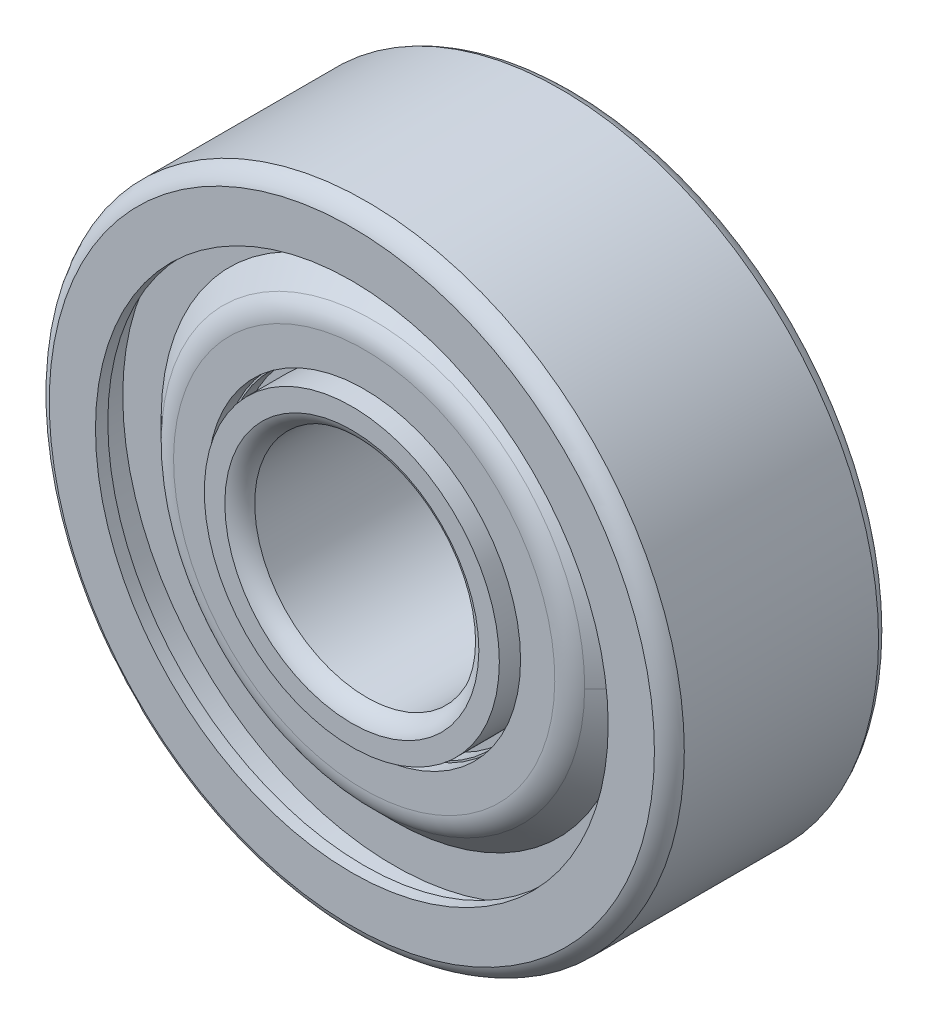
ISO-10303-21;
HEADER;
FILE_DESCRIPTION(('STEP AP214'),'2;1');
FILE_NAME('part.step','',(''),(''),'','','');
FILE_SCHEMA(('AUTOMOTIVE_DESIGN { 1 0 10303 214 1 1 1 1 }'));
ENDSEC;
DATA;
#1=APPLICATION_CONTEXT('core data for automotive mechanical design processes');
#2=APPLICATION_PROTOCOL_DEFINITION('international standard','automotive_design',2000,#1);
#3=PRODUCT_CONTEXT('',#1,'mechanical');
#4=PRODUCT('Part','Part','',(#3));
#5=PRODUCT_RELATED_PRODUCT_CATEGORY('part','',(#4));
#6=PRODUCT_DEFINITION_FORMATION('','',#4);
#7=PRODUCT_DEFINITION_CONTEXT('part definition',#1,'design');
#8=PRODUCT_DEFINITION('design','',#6,#7);
#9=PRODUCT_DEFINITION_SHAPE('','',#8);
#10=(LENGTH_UNIT() NAMED_UNIT(*) SI_UNIT(.MILLI.,.METRE.));
#11=(NAMED_UNIT(*) PLANE_ANGLE_UNIT() SI_UNIT($,.RADIAN.));
#12=(NAMED_UNIT(*) SI_UNIT($,.STERADIAN.) SOLID_ANGLE_UNIT());
#13=UNCERTAINTY_MEASURE_WITH_UNIT(LENGTH_MEASURE(1.E-05),#10,'distance_accuracy_value','');
#14=(GEOMETRIC_REPRESENTATION_CONTEXT(3) GLOBAL_UNCERTAINTY_ASSIGNED_CONTEXT((#13)) GLOBAL_UNIT_ASSIGNED_CONTEXT((#10,
#11,#12)) REPRESENTATION_CONTEXT('',''));
#15=CARTESIAN_POINT('',(0.,0.,0.));
#16=DIRECTION('',(0.,0.,1.));
#17=DIRECTION('',(1.,0.,0.));
#18=AXIS2_PLACEMENT_3D('',#15,#16,#17);
#19=CARTESIAN_POINT('',(0.,0.,-101.5));
#20=DIRECTION('',(0.,0.,-1.));
#21=DIRECTION('',(-1.,0.,0.));
#22=AXIS2_PLACEMENT_3D('',#19,#20,#21);
#23=CYLINDRICAL_SURFACE('',#22,3.);
#24=CARTESIAN_POINT('',(0.,0.,-101.9));
#25=DIRECTION('',(0.,0.,1.));
#26=DIRECTION('',(0.999955923651329,-0.00938886332935335,0.));
#27=AXIS2_PLACEMENT_3D('',#24,#25,#26);
#28=CIRCLE('',#27,3.);
#29=CARTESIAN_POINT('',(2.99986777095396,-0.0281665899880601,-101.9));
#30=VERTEX_POINT('',#29);
#31=EDGE_CURVE('E249',#30,#30,#28,.F.);
#32=ORIENTED_EDGE('',*,*,#31,.F.);
#33=EDGE_LOOP('',(#32));
#34=FACE_BOUND('',#33,.T.);
#35=CARTESIAN_POINT('',(0.,0.,-107.1));
#36=DIRECTION('',(0.,0.,-1.));
#37=DIRECTION('',(0.999955923651329,-0.00938886332935335,0.));
#38=AXIS2_PLACEMENT_3D('',#35,#36,#37);
#39=CIRCLE('',#38,3.);
#40=CARTESIAN_POINT('',(2.99986777095395,-0.0281665899880603,-107.1));
#41=VERTEX_POINT('',#40);
#42=EDGE_CURVE('E252',#41,#41,#39,.F.);
#43=ORIENTED_EDGE('',*,*,#42,.F.);
#44=EDGE_LOOP('',(#43));
#45=FACE_BOUND('',#44,.T.);
#46=ADVANCED_FACE('F16',(#34,#45),#23,.F.);
#47=CARTESIAN_POINT('',(0.,0.,-106.86637722008));
#48=DIRECTION('',(0.,0.,-1.));
#49=DIRECTION('',(0.999955923651329,-0.00938886332935335,0.));
#50=AXIS2_PLACEMENT_3D('',#47,#48,#49);
#51=TOROIDAL_SURFACE('',#50,3.63362277992017,0.67532024294507);
#52=CARTESIAN_POINT('',(0.,0.,-107.5));
#53=DIRECTION('',(0.,0.,-1.));
#54=DIRECTION('',(-1.,0.,0.));
#55=AXIS2_PLACEMENT_3D('',#52,#53,#54);
#56=CIRCLE('',#55,3.4);
#57=CARTESIAN_POINT('',(-3.40000000000003,0.,-107.5));
#58=VERTEX_POINT('',#57);
#59=EDGE_CURVE('E247',#58,#58,#56,.F.);
#60=ORIENTED_EDGE('',*,*,#59,.F.);
#61=EDGE_LOOP('',(#60));
#62=FACE_BOUND('',#61,.T.);
#63=ORIENTED_EDGE('',*,*,#42,.T.);
#64=EDGE_LOOP('',(#63));
#65=FACE_BOUND('',#64,.T.);
#66=ADVANCED_FACE('F168',(#62,#65),#51,.T.);
#67=CARTESIAN_POINT('',(0.,0.,-102.13362277992));
#68=DIRECTION('',(0.,0.,1.));
#69=DIRECTION('',(0.999955923651329,-0.00938886332935335,0.));
#70=AXIS2_PLACEMENT_3D('',#67,#68,#69);
#71=TOROIDAL_SURFACE('',#70,3.63362277992017,0.67532024294507);
#72=CARTESIAN_POINT('',(0.,0.,-101.5));
#73=DIRECTION('',(0.,0.,1.));
#74=DIRECTION('',(1.,0.,0.));
#75=AXIS2_PLACEMENT_3D('',#72,#73,#74);
#76=CIRCLE('',#75,3.40000000000001);
#77=CARTESIAN_POINT('',(3.39999999999998,0.,-101.5));
#78=VERTEX_POINT('',#77);
#79=EDGE_CURVE('E245',#78,#78,#76,.T.);
#80=ORIENTED_EDGE('',*,*,#79,.T.);
#81=EDGE_LOOP('',(#80));
#82=FACE_BOUND('',#81,.T.);
#83=ORIENTED_EDGE('',*,*,#31,.T.);
#84=EDGE_LOOP('',(#83));
#85=FACE_BOUND('',#84,.T.);
#86=ADVANCED_FACE('F164',(#82,#85),#71,.T.);
#87=CARTESIAN_POINT('',(0.,0.,-107.5));
#88=DIRECTION('',(0.,0.,-1.));
#89=DIRECTION('',(-1.,0.,0.));
#90=AXIS2_PLACEMENT_3D('',#87,#88,#89);
#91=PLANE('',#90);
#92=ORIENTED_EDGE('',*,*,#59,.T.);
#93=EDGE_LOOP('',(#92));
#94=FACE_BOUND('',#93,.T.);
#95=CARTESIAN_POINT('',(0.,0.,-107.5));
#96=DIRECTION('',(0.,0.,-1.));
#97=DIRECTION('',(-1.,0.,0.));
#98=AXIS2_PLACEMENT_3D('',#95,#96,#97);
#99=CIRCLE('',#98,3.94895761070571);
#100=CARTESIAN_POINT('',(-3.94895761070574,0.,-107.5));
#101=VERTEX_POINT('',#100);
#102=EDGE_CURVE('E242',#101,#101,#99,.F.);
#103=ORIENTED_EDGE('',*,*,#102,.F.);
#104=EDGE_LOOP('',(#103));
#105=FACE_BOUND('',#104,.T.);
#106=ADVANCED_FACE('F167',(#94,#105),#91,.T.);
#107=CARTESIAN_POINT('',(0.,0.,-101.5));
#108=DIRECTION('',(0.,0.,-1.));
#109=DIRECTION('',(-1.,0.,0.));
#110=AXIS2_PLACEMENT_3D('',#107,#108,#109);
#111=PLANE('',#110);
#112=ORIENTED_EDGE('',*,*,#79,.F.);
#113=EDGE_LOOP('',(#112));
#114=FACE_BOUND('',#113,.T.);
#115=CARTESIAN_POINT('',(0.,0.,-101.5));
#116=DIRECTION('',(0.,0.,1.));
#117=DIRECTION('',(1.,0.,0.));
#118=AXIS2_PLACEMENT_3D('',#115,#116,#117);
#119=CIRCLE('',#118,3.94895761070571);
#120=CARTESIAN_POINT('',(3.94895761070568,0.,-101.5));
#121=VERTEX_POINT('',#120);
#122=EDGE_CURVE('E239',#121,#121,#119,.F.);
#123=ORIENTED_EDGE('',*,*,#122,.F.);
#124=EDGE_LOOP('',(#123));
#125=FACE_BOUND('',#124,.T.);
#126=ADVANCED_FACE('F397',(#114,#125),#111,.F.);
#127=CARTESIAN_POINT('',(0.,0.,-107.1698));
#128=DIRECTION('',(0.,0.,-1.));
#129=DIRECTION('',(-1.,0.,0.));
#130=AXIS2_PLACEMENT_3D('',#127,#128,#129);
#131=CYLINDRICAL_SURFACE('',#130,3.94895761070571);
#132=CARTESIAN_POINT('',(0.,0.,-106.3698));
#133=DIRECTION('',(0.,0.,-1.));
#134=DIRECTION('',(-1.,0.,0.));
#135=AXIS2_PLACEMENT_3D('',#132,#133,#134);
#136=CIRCLE('',#135,3.94895761070571);
#137=CARTESIAN_POINT('',(-3.94895761070574,0.,-106.3698));
#138=VERTEX_POINT('',#137);
#139=EDGE_CURVE('E236',#138,#138,#136,.F.);
#140=ORIENTED_EDGE('',*,*,#139,.F.);
#141=EDGE_LOOP('',(#140));
#142=FACE_BOUND('',#141,.T.);
#143=ORIENTED_EDGE('',*,*,#102,.T.);
#144=EDGE_LOOP('',(#143));
#145=FACE_BOUND('',#144,.T.);
#146=ADVANCED_FACE('F394',(#142,#145),#131,.T.);
#147=CARTESIAN_POINT('',(0.,0.,-101.8302));
#148=DIRECTION('',(0.,0.,1.));
#149=DIRECTION('',(1.,0.,0.));
#150=AXIS2_PLACEMENT_3D('',#147,#148,#149);
#151=CYLINDRICAL_SURFACE('',#150,3.94895761070571);
#152=ORIENTED_EDGE('',*,*,#122,.T.);
#153=EDGE_LOOP('',(#152));
#154=FACE_BOUND('',#153,.T.);
#155=CARTESIAN_POINT('',(0.,0.,-102.6302));
#156=DIRECTION('',(0.,0.,1.));
#157=DIRECTION('',(1.,0.,0.));
#158=AXIS2_PLACEMENT_3D('',#155,#156,#157);
#159=CIRCLE('',#158,3.94895761070571);
#160=CARTESIAN_POINT('',(3.94895761070568,0.,-102.6302));
#161=VERTEX_POINT('',#160);
#162=EDGE_CURVE('E233',#161,#161,#159,.F.);
#163=ORIENTED_EDGE('',*,*,#162,.F.);
#164=EDGE_LOOP('',(#163));
#165=FACE_BOUND('',#164,.T.);
#166=ADVANCED_FACE('F390',(#154,#165),#151,.T.);
#167=CARTESIAN_POINT('',(0.,0.,-106.3698));
#168=DIRECTION('',(0.,0.,-1.));
#169=DIRECTION('',(-1.,0.,0.));
#170=AXIS2_PLACEMENT_3D('',#167,#168,#169);
#171=PLANE('',#170);
#172=CARTESIAN_POINT('',(0.,0.,-106.3698));
#173=DIRECTION('',(0.,0.,-1.));
#174=DIRECTION('',(-1.,0.,0.));
#175=AXIS2_PLACEMENT_3D('',#172,#173,#174);
#176=CIRCLE('',#175,4.14575218036815);
#177=CARTESIAN_POINT('',(-4.14575218036818,0.,-106.3698));
#178=VERTEX_POINT('',#177);
#179=EDGE_CURVE('E230',#178,#178,#176,.T.);
#180=ORIENTED_EDGE('',*,*,#179,.T.);
#181=EDGE_LOOP('',(#180));
#182=FACE_BOUND('',#181,.T.);
#183=ORIENTED_EDGE('',*,*,#139,.T.);
#184=EDGE_LOOP('',(#183));
#185=FACE_BOUND('',#184,.T.);
#186=ADVANCED_FACE('F386',(#182,#185),#171,.T.);
#187=CARTESIAN_POINT('',(0.,0.,-102.6302));
#188=DIRECTION('',(0.,0.,1.));
#189=DIRECTION('',(1.,0.,0.));
#190=AXIS2_PLACEMENT_3D('',#187,#188,#189);
#191=PLANE('',#190);
#192=ORIENTED_EDGE('',*,*,#162,.T.);
#193=EDGE_LOOP('',(#192));
#194=FACE_BOUND('',#193,.T.);
#195=CARTESIAN_POINT('',(0.,0.,-102.6302));
#196=DIRECTION('',(0.,0.,1.));
#197=DIRECTION('',(1.,0.,0.));
#198=AXIS2_PLACEMENT_3D('',#195,#196,#197);
#199=CIRCLE('',#198,4.14575218036815);
#200=CARTESIAN_POINT('',(4.14575218036812,0.,-102.6302));
#201=VERTEX_POINT('',#200);
#202=EDGE_CURVE('E227',#201,#201,#199,.T.);
#203=ORIENTED_EDGE('',*,*,#202,.T.);
#204=EDGE_LOOP('',(#203));
#205=FACE_BOUND('',#204,.T.);
#206=ADVANCED_FACE('F382',(#194,#205),#191,.T.);
#207=CARTESIAN_POINT('',(0.,0.,-106.3698));
#208=DIRECTION('',(0.,0.,-1.));
#209=DIRECTION('',(-1.,0.,0.));
#210=AXIS2_PLACEMENT_3D('',#207,#208,#209);
#211=CYLINDRICAL_SURFACE('',#210,4.14575218036815);
#212=CARTESIAN_POINT('',(0.,0.,-106.7698));
#213=DIRECTION('',(0.,0.,-1.));
#214=DIRECTION('',(-1.,0.,0.));
#215=AXIS2_PLACEMENT_3D('',#212,#213,#214);
#216=CIRCLE('',#215,4.14575218036815);
#217=CARTESIAN_POINT('',(-4.14575218036818,0.,-106.7698));
#218=VERTEX_POINT('',#217);
#219=EDGE_CURVE('E224',#218,#218,#216,.F.);
#220=ORIENTED_EDGE('',*,*,#219,.F.);
#221=EDGE_LOOP('',(#220));
#222=FACE_BOUND('',#221,.T.);
#223=ORIENTED_EDGE('',*,*,#179,.F.);
#224=EDGE_LOOP('',(#223));
#225=FACE_BOUND('',#224,.T.);
#226=ADVANCED_FACE('F378',(#222,#225),#211,.F.);
#227=CARTESIAN_POINT('',(0.,0.,-102.6302));
#228=DIRECTION('',(0.,0.,1.));
#229=DIRECTION('',(1.,0.,0.));
#230=AXIS2_PLACEMENT_3D('',#227,#228,#229);
#231=CYLINDRICAL_SURFACE('',#230,4.14575218036815);
#232=ORIENTED_EDGE('',*,*,#202,.F.);
#233=EDGE_LOOP('',(#232));
#234=FACE_BOUND('',#233,.T.);
#235=CARTESIAN_POINT('',(0.,0.,-102.2302));
#236=DIRECTION('',(0.,0.,1.));
#237=DIRECTION('',(1.,0.,0.));
#238=AXIS2_PLACEMENT_3D('',#235,#236,#237);
#239=CIRCLE('',#238,4.14575218036815);
#240=CARTESIAN_POINT('',(4.14575218036812,0.,-102.2302));
#241=VERTEX_POINT('',#240);
#242=EDGE_CURVE('E221',#241,#241,#239,.F.);
#243=ORIENTED_EDGE('',*,*,#242,.F.);
#244=EDGE_LOOP('',(#243));
#245=FACE_BOUND('',#244,.T.);
#246=ADVANCED_FACE('F372',(#234,#245),#231,.F.);
#247=CARTESIAN_POINT('',(0.,0.,-106.7698));
#248=DIRECTION('',(0.,0.,-1.));
#249=DIRECTION('',(-1.,0.,0.));
#250=AXIS2_PLACEMENT_3D('',#247,#248,#249);
#251=PLANE('',#250);
#252=CARTESIAN_POINT('',(0.,0.,-106.7698));
#253=DIRECTION('',(0.,0.,-1.));
#254=DIRECTION('',(-1.,0.,0.));
#255=AXIS2_PLACEMENT_3D('',#252,#253,#254);
#256=CIRCLE('',#255,4.18653780548264);
#257=CARTESIAN_POINT('',(-4.18653780548267,0.,-106.7698));
#258=VERTEX_POINT('',#257);
#259=EDGE_CURVE('E218',#258,#258,#256,.T.);
#260=ORIENTED_EDGE('',*,*,#259,.T.);
#261=EDGE_LOOP('',(#260));
#262=FACE_BOUND('',#261,.T.);
#263=ORIENTED_EDGE('',*,*,#219,.T.);
#264=EDGE_LOOP('',(#263));
#265=FACE_BOUND('',#264,.T.);
#266=ADVANCED_FACE('F366',(#262,#265),#251,.T.);
#267=CARTESIAN_POINT('',(0.,0.,-102.2302));
#268=DIRECTION('',(0.,0.,1.));
#269=DIRECTION('',(1.,0.,0.));
#270=AXIS2_PLACEMENT_3D('',#267,#268,#269);
#271=PLANE('',#270);
#272=ORIENTED_EDGE('',*,*,#242,.T.);
#273=EDGE_LOOP('',(#272));
#274=FACE_BOUND('',#273,.T.);
#275=CARTESIAN_POINT('',(0.,0.,-102.2302));
#276=DIRECTION('',(0.,0.,1.));
#277=DIRECTION('',(1.,0.,0.));
#278=AXIS2_PLACEMENT_3D('',#275,#276,#277);
#279=CIRCLE('',#278,4.18653780548264);
#280=CARTESIAN_POINT('',(4.18653780548261,0.,-102.2302));
#281=VERTEX_POINT('',#280);
#282=EDGE_CURVE('E215',#281,#281,#279,.T.);
#283=ORIENTED_EDGE('',*,*,#282,.T.);
#284=EDGE_LOOP('',(#283));
#285=FACE_BOUND('',#284,.T.);
#286=ADVANCED_FACE('F361',(#274,#285),#271,.T.);
#287=CARTESIAN_POINT('',(0.,0.,-106.7698));
#288=DIRECTION('',(0.,0.,-1.));
#289=DIRECTION('',(-1.,0.,0.));
#290=AXIS2_PLACEMENT_3D('',#287,#288,#289);
#291=CYLINDRICAL_SURFACE('',#290,4.18653780548264);
#292=CARTESIAN_POINT('',(0.,0.,-107.1698));
#293=DIRECTION('',(0.,0.,-1.));
#294=DIRECTION('',(-1.,0.,0.));
#295=AXIS2_PLACEMENT_3D('',#292,#293,#294);
#296=CIRCLE('',#295,4.18653780548264);
#297=CARTESIAN_POINT('',(-4.18653780548267,0.,-107.1698));
#298=VERTEX_POINT('',#297);
#299=EDGE_CURVE('E212',#298,#298,#296,.F.);
#300=ORIENTED_EDGE('',*,*,#299,.F.);
#301=EDGE_LOOP('',(#300));
#302=FACE_BOUND('',#301,.T.);
#303=ORIENTED_EDGE('',*,*,#259,.F.);
#304=EDGE_LOOP('',(#303));
#305=FACE_BOUND('',#304,.T.);
#306=ADVANCED_FACE('F356',(#302,#305),#291,.F.);
#307=CARTESIAN_POINT('',(0.,0.,-102.2302));
#308=DIRECTION('',(0.,0.,1.));
#309=DIRECTION('',(1.,0.,0.));
#310=AXIS2_PLACEMENT_3D('',#307,#308,#309);
#311=CYLINDRICAL_SURFACE('',#310,4.18653780548264);
#312=ORIENTED_EDGE('',*,*,#282,.F.);
#313=EDGE_LOOP('',(#312));
#314=FACE_BOUND('',#313,.T.);
#315=CARTESIAN_POINT('',(0.,0.,-101.8302));
#316=DIRECTION('',(0.,0.,1.));
#317=DIRECTION('',(1.,0.,0.));
#318=AXIS2_PLACEMENT_3D('',#315,#316,#317);
#319=CIRCLE('',#318,4.18653780548264);
#320=CARTESIAN_POINT('',(4.18653780548261,0.,-101.8302));
#321=VERTEX_POINT('',#320);
#322=EDGE_CURVE('E121',#321,#321,#319,.F.);
#323=ORIENTED_EDGE('',*,*,#322,.F.);
#324=EDGE_LOOP('',(#323));
#325=FACE_BOUND('',#324,.T.);
#326=ADVANCED_FACE('F139',(#314,#325),#311,.F.);
#327=CARTESIAN_POINT('',(0.,0.,-107.1698));
#328=DIRECTION('',(0.,0.,-1.));
#329=DIRECTION('',(-1.,0.,0.));
#330=AXIS2_PLACEMENT_3D('',#327,#328,#329);
#331=PLANE('',#330);
#332=CARTESIAN_POINT('',(0.,0.,-107.1698));
#333=DIRECTION('',(0.,0.,1.));
#334=DIRECTION('',(-0.999955923651329,0.00938886332935322,0.));
#335=AXIS2_PLACEMENT_3D('',#332,#333,#334);
#336=CIRCLE('',#335,5.10245401946636);
#337=CARTESIAN_POINT('',(-5.10222912192395,0.0479062434330784,-107.1698));
#338=VERTEX_POINT('',#337);
#339=CARTESIAN_POINT('',(5.10222912192389,-0.0479062434330796,-107.1698));
#340=VERTEX_POINT('',#339);
#341=EDGE_CURVE('E117',#338,#340,#336,.T.);
#342=ORIENTED_EDGE('',*,*,#341,.F.);
#343=CARTESIAN_POINT('',(0.,0.,-107.1698));
#344=DIRECTION('',(0.,0.,1.));
#345=DIRECTION('',(0.999955923651329,-0.0093888633293531,0.));
#346=AXIS2_PLACEMENT_3D('',#343,#344,#345);
#347=CIRCLE('',#346,5.10245401946636);
#348=EDGE_CURVE('E114',#340,#338,#347,.T.);
#349=ORIENTED_EDGE('',*,*,#348,.F.);
#350=EDGE_LOOP('',(#342,#349));
#351=FACE_BOUND('',#350,.T.);
#352=ORIENTED_EDGE('',*,*,#299,.T.);
#353=EDGE_LOOP('',(#352));
#354=FACE_BOUND('',#353,.T.);
#355=ADVANCED_FACE('F122',(#351,#354),#331,.T.);
#356=CARTESIAN_POINT('',(0.,0.,-101.8302));
#357=DIRECTION('',(0.,0.,1.));
#358=DIRECTION('',(1.,0.,0.));
#359=AXIS2_PLACEMENT_3D('',#356,#357,#358);
#360=PLANE('',#359);
#361=ORIENTED_EDGE('',*,*,#322,.T.);
#362=EDGE_LOOP('',(#361));
#363=FACE_BOUND('',#362,.T.);
#364=CARTESIAN_POINT('',(0.,0.,-101.8302));
#365=DIRECTION('',(0.,0.,-1.));
#366=DIRECTION('',(0.999955923651329,-0.00938886332935347,0.));
#367=AXIS2_PLACEMENT_3D('',#364,#365,#366);
#368=CIRCLE('',#367,5.10245401946635);
#369=CARTESIAN_POINT('',(5.10222912192388,-0.0479062434330798,-101.8302));
#370=VERTEX_POINT('',#369);
#371=CARTESIAN_POINT('',(-5.10222912192394,0.0479062434330792,-101.8302));
#372=VERTEX_POINT('',#371);
#373=EDGE_CURVE('E124',#370,#372,#368,.T.);
#374=ORIENTED_EDGE('',*,*,#373,.F.);
#375=CARTESIAN_POINT('',(0.,0.,-101.8302));
#376=DIRECTION('',(0.,0.,-1.));
#377=DIRECTION('',(-0.999955923651329,0.00938886332935359,0.));
#378=AXIS2_PLACEMENT_3D('',#375,#376,#377);
#379=CIRCLE('',#378,5.10245401946635);
#380=EDGE_CURVE('E325',#372,#370,#379,.T.);
#381=ORIENTED_EDGE('',*,*,#380,.F.);
#382=EDGE_LOOP('',(#374,#381));
#383=FACE_BOUND('',#382,.T.);
#384=ADVANCED_FACE('F138',(#363,#383),#360,.T.);
#385=CARTESIAN_POINT('',(0.,0.,-106.3698));
#386=DIRECTION('',(0.,0.,-1.));
#387=DIRECTION('',(0.999955923651329,-0.00938886332935334,0.));
#388=AXIS2_PLACEMENT_3D('',#385,#386,#387);
#389=TOROIDAL_SURFACE('',#388,5.10245401946636,0.8);
#390=ORIENTED_EDGE('',*,*,#348,.T.);
#391=ORIENTED_EDGE('',*,*,#341,.T.);
#392=EDGE_LOOP('',(#390,#391));
#393=FACE_BOUND('',#392,.T.);
#394=CARTESIAN_POINT('',(0.,0.,-106.93548542497));
#395=DIRECTION('',(0.,0.,1.));
#396=DIRECTION('',(-0.999955923651331,0.00938886332913898,0.));
#397=AXIS2_PLACEMENT_3D('',#394,#395,#396);
#398=CIRCLE('',#397,5.66813944439582);
#399=CARTESIAN_POINT('',(-5.66788961350539,0.0532173865739338,-106.93548542497));
#400=VERTEX_POINT('',#399);
#401=EDGE_CURVE('E63',#400,#400,#398,.T.);
#402=ORIENTED_EDGE('',*,*,#401,.F.);
#403=EDGE_LOOP('',(#402));
#404=FACE_BOUND('',#403,.T.);
#405=ADVANCED_FACE('F92',(#393,#404),#389,.T.);
#406=CARTESIAN_POINT('',(0.,0.,-102.6302));
#407=DIRECTION('',(0.,0.,1.));
#408=DIRECTION('',(-0.999955923651329,0.00938886332935335,0.));
#409=AXIS2_PLACEMENT_3D('',#406,#407,#408);
#410=TOROIDAL_SURFACE('',#409,5.10245401946635,0.8);
#411=CARTESIAN_POINT('',(0.,0.,-102.064514575034));
#412=DIRECTION('',(0.,0.,-1.));
#413=DIRECTION('',(0.999955923651329,-0.00938886332935804,0.));
#414=AXIS2_PLACEMENT_3D('',#411,#412,#413);
#415=CIRCLE('',#414,5.66813944445274);
#416=CARTESIAN_POINT('',(5.66788961353874,-0.0532173865752173,-102.064514575009));
#417=VERTEX_POINT('',#416);
#418=CARTESIAN_POINT('',(-5.66788961349154,0.0532173865753063,-102.064514574976));
#419=VERTEX_POINT('',#418);
#420=EDGE_CURVE('E57',#417,#419,#415,.T.);
#421=ORIENTED_EDGE('',*,*,#420,.F.);
#422=CARTESIAN_POINT('',(0.,0.,-102.064514575034));
#423=DIRECTION('',(0.,0.,-1.));
#424=DIRECTION('',(0.999955923651329,-0.00938886332935804,0.));
#425=AXIS2_PLACEMENT_3D('',#422,#423,#424);
#426=CIRCLE('',#425,5.66813944445274);
#427=EDGE_CURVE('E65',#419,#417,#426,.T.);
#428=ORIENTED_EDGE('',*,*,#427,.F.);
#429=EDGE_LOOP('',(#421,#428));
#430=FACE_BOUND('',#429,.T.);
#431=ORIENTED_EDGE('',*,*,#380,.T.);
#432=ORIENTED_EDGE('',*,*,#373,.T.);
#433=EDGE_LOOP('',(#431,#432));
#434=FACE_BOUND('',#433,.T.);
#435=ADVANCED_FACE('F66',(#430,#434),#410,.T.);
#436=CARTESIAN_POINT('',(0.,0.,-106.369799999982));
#437=DIRECTION('',(0.,0.,1.));
#438=DIRECTION('',(0.,-1.,0.));
#439=AXIS2_PLACEMENT_3D('',#436,#437,#438);
#440=CONICAL_SURFACE('',#439,6.23382486938915,0.78539816340233);
#441=CARTESIAN_POINT('',(0.,0.,-106.369799999982));
#442=DIRECTION('',(0.,0.,1.));
#443=DIRECTION('',(0.,-1.,0.));
#444=AXIS2_PLACEMENT_3D('',#441,#442,#443);
#445=CIRCLE('',#444,6.23382486938919);
#446=CARTESIAN_POINT('',(0.,-6.23382486938919,-106.369799999982));
#447=VERTEX_POINT('',#446);
#448=EDGE_CURVE('E202',#447,#447,#445,.T.);
#449=ORIENTED_EDGE('',*,*,#448,.F.);
#450=EDGE_LOOP('',(#449));
#451=FACE_BOUND('',#450,.T.);
#452=ORIENTED_EDGE('',*,*,#401,.T.);
#453=EDGE_LOOP('',(#452));
#454=FACE_BOUND('',#453,.T.);
#455=ADVANCED_FACE('F91',(#451,#454),#440,.T.);
#456=CARTESIAN_POINT('',(0.,0.,-102.630199999908));
#457=DIRECTION('',(0.,0.,-1.));
#458=DIRECTION('',(0.,1.,0.));
#459=AXIS2_PLACEMENT_3D('',#456,#457,#458);
#460=CONICAL_SURFACE('',#459,6.23382486933237,0.78539816335209);
#461=CARTESIAN_POINT('',(0.,0.,-102.630199999965));
#462=DIRECTION('',(0.,0.,-1.));
#463=DIRECTION('',(0.,1.,0.));
#464=AXIS2_PLACEMENT_3D('',#461,#462,#463);
#465=CIRCLE('',#464,6.23382486938922);
#466=CARTESIAN_POINT('',(6.2335501051791,-0.0585285297176159,-102.630199999993));
#467=VERTEX_POINT('',#466);
#468=CARTESIAN_POINT('',(-6.23355010523599,0.058528529719215,-102.630199999993));
#469=VERTEX_POINT('',#468);
#470=EDGE_CURVE('E39',#467,#469,#465,.T.);
#471=ORIENTED_EDGE('',*,*,#470,.F.);
#472=DIRECTION('',(-0.707075614501515,0.00663892892781952,0.707106781186545));
#473=VECTOR('',#472,1.);
#474=CARTESIAN_POINT('',(498881.613775686,-4684.13774895583,-499000.));
#475=LINE('',#474,#473);
#476=EDGE_CURVE('E60',#417,#467,#475,.F.);
#477=ORIENTED_EDGE('',*,*,#476,.F.);
#478=ORIENTED_EDGE('',*,*,#420,.T.);
#479=DIRECTION('',(0.707075614501515,-0.00663892892787243,0.707106781186545));
#480=VECTOR('',#479,1.);
#481=CARTESIAN_POINT('',(-498881.613775686,4684.13774899316,-499000.));
#482=LINE('',#481,#480);
#483=EDGE_CURVE('E34',#469,#419,#482,.T.);
#484=ORIENTED_EDGE('',*,*,#483,.F.);
#485=EDGE_LOOP('',(#471,#477,#478,#484));
#486=FACE_BOUND('',#485,.T.);
#487=ADVANCED_FACE('F59',(#486),#460,.T.);
#488=CARTESIAN_POINT('',(0.,0.,-102.630199999908));
#489=DIRECTION('',(0.,0.,-1.));
#490=DIRECTION('',(0.,1.,0.));
#491=AXIS2_PLACEMENT_3D('',#488,#489,#490);
#492=CONICAL_SURFACE('',#491,6.23382486933237,0.785398163402335);
#493=ORIENTED_EDGE('',*,*,#476,.T.);
#494=CARTESIAN_POINT('',(0.,0.,-102.630200000021));
#495=DIRECTION('',(0.,0.,-1.));
#496=DIRECTION('',(0.,1.,0.));
#497=AXIS2_PLACEMENT_3D('',#494,#495,#496);
#498=CIRCLE('',#497,6.23382486944604);
#499=EDGE_CURVE('E72',#469,#467,#498,.T.);
#500=ORIENTED_EDGE('',*,*,#499,.F.);
#501=ORIENTED_EDGE('',*,*,#483,.T.);
#502=ORIENTED_EDGE('',*,*,#427,.T.);
#503=EDGE_LOOP('',(#493,#500,#501,#502));
#504=FACE_BOUND('',#503,.T.);
#505=ADVANCED_FACE('F70',(#504),#492,.T.);
#506=CARTESIAN_POINT('',(0.,0.,-106.3698));
#507=DIRECTION('',(0.,0.,-1.));
#508=DIRECTION('',(-1.,0.,0.));
#509=AXIS2_PLACEMENT_3D('',#506,#507,#508);
#510=PLANE('',#509);
#511=CARTESIAN_POINT('',(0.,0.,-106.3698));
#512=DIRECTION('',(0.,0.,-1.));
#513=DIRECTION('',(-1.,0.,0.));
#514=AXIS2_PLACEMENT_3D('',#511,#512,#513);
#515=CIRCLE('',#514,7.26217582046821);
#516=CARTESIAN_POINT('',(-7.26217582046824,0.,-106.3698));
#517=VERTEX_POINT('',#516);
#518=EDGE_CURVE('E284',#517,#517,#515,.T.);
#519=ORIENTED_EDGE('',*,*,#518,.T.);
#520=EDGE_LOOP('',(#519));
#521=FACE_BOUND('',#520,.T.);
#522=ORIENTED_EDGE('',*,*,#448,.T.);
#523=EDGE_LOOP('',(#522));
#524=FACE_BOUND('',#523,.T.);
#525=ADVANCED_FACE('F291',(#521,#524),#510,.T.);
#526=CARTESIAN_POINT('',(0.,0.,-102.6302));
#527=DIRECTION('',(0.,0.,1.));
#528=DIRECTION('',(1.,0.,0.));
#529=AXIS2_PLACEMENT_3D('',#526,#527,#528);
#530=PLANE('',#529);
#531=ORIENTED_EDGE('',*,*,#470,.T.);
#532=ORIENTED_EDGE('',*,*,#499,.T.);
#533=EDGE_LOOP('',(#531,#532));
#534=FACE_BOUND('',#533,.T.);
#535=CARTESIAN_POINT('',(0.,0.,-102.6302));
#536=DIRECTION('',(0.,0.,1.));
#537=DIRECTION('',(1.,0.,0.));
#538=AXIS2_PLACEMENT_3D('',#535,#536,#537);
#539=CIRCLE('',#538,7.26217582046821);
#540=CARTESIAN_POINT('',(7.26217582046818,0.,-102.6302));
#541=VERTEX_POINT('',#540);
#542=EDGE_CURVE('E281',#541,#541,#539,.T.);
#543=ORIENTED_EDGE('',*,*,#542,.T.);
#544=EDGE_LOOP('',(#543));
#545=FACE_BOUND('',#544,.T.);
#546=ADVANCED_FACE('F287',(#534,#545),#530,.T.);
#547=CARTESIAN_POINT('',(0.,0.,-106.3698));
#548=DIRECTION('',(0.,0.,-1.));
#549=DIRECTION('',(-1.,0.,0.));
#550=AXIS2_PLACEMENT_3D('',#547,#548,#549);
#551=CYLINDRICAL_SURFACE('',#550,7.26217582046821);
#552=ORIENTED_EDGE('',*,*,#518,.F.);
#553=EDGE_LOOP('',(#552));
#554=FACE_BOUND('',#553,.T.);
#555=CARTESIAN_POINT('',(0.,0.,-107.1698));
#556=DIRECTION('',(0.,0.,-1.));
#557=DIRECTION('',(-1.,0.,0.));
#558=AXIS2_PLACEMENT_3D('',#555,#556,#557);
#559=CIRCLE('',#558,7.26217582046821);
#560=CARTESIAN_POINT('',(-7.26217582046824,0.,-107.1698));
#561=VERTEX_POINT('',#560);
#562=EDGE_CURVE('E278',#561,#561,#559,.T.);
#563=ORIENTED_EDGE('',*,*,#562,.T.);
#564=EDGE_LOOP('',(#563));
#565=FACE_BOUND('',#564,.T.);
#566=ADVANCED_FACE('F290',(#554,#565),#551,.F.);
#567=CARTESIAN_POINT('',(0.,0.,-102.6302));
#568=DIRECTION('',(0.,0.,1.));
#569=DIRECTION('',(1.,0.,0.));
#570=AXIS2_PLACEMENT_3D('',#567,#568,#569);
#571=CYLINDRICAL_SURFACE('',#570,7.26217582046821);
#572=CARTESIAN_POINT('',(0.,0.,-101.8302));
#573=DIRECTION('',(0.,0.,1.));
#574=DIRECTION('',(1.,0.,0.));
#575=AXIS2_PLACEMENT_3D('',#572,#573,#574);
#576=CIRCLE('',#575,7.26217582046821);
#577=CARTESIAN_POINT('',(7.26217582046818,0.,-101.8302));
#578=VERTEX_POINT('',#577);
#579=EDGE_CURVE('E275',#578,#578,#576,.T.);
#580=ORIENTED_EDGE('',*,*,#579,.T.);
#581=EDGE_LOOP('',(#580));
#582=FACE_BOUND('',#581,.T.);
#583=ORIENTED_EDGE('',*,*,#542,.F.);
#584=EDGE_LOOP('',(#583));
#585=FACE_BOUND('',#584,.T.);
#586=ADVANCED_FACE('F295',(#582,#585),#571,.F.);
#587=CARTESIAN_POINT('',(0.,0.,-107.1698));
#588=DIRECTION('',(0.,0.,-1.));
#589=DIRECTION('',(-1.,0.,0.));
#590=AXIS2_PLACEMENT_3D('',#587,#588,#589);
#591=PLANE('',#590);
#592=CARTESIAN_POINT('',(0.,0.,-107.1698));
#593=DIRECTION('',(0.,0.,-1.));
#594=DIRECTION('',(-1.,0.,0.));
#595=AXIS2_PLACEMENT_3D('',#592,#593,#594);
#596=CIRCLE('',#595,6.86217582046821);
#597=CARTESIAN_POINT('',(-6.86217582046824,0.,-107.1698));
#598=VERTEX_POINT('',#597);
#599=EDGE_CURVE('E272',#598,#598,#596,.T.);
#600=ORIENTED_EDGE('',*,*,#599,.T.);
#601=EDGE_LOOP('',(#600));
#602=FACE_BOUND('',#601,.T.);
#603=ORIENTED_EDGE('',*,*,#562,.F.);
#604=EDGE_LOOP('',(#603));
#605=FACE_BOUND('',#604,.T.);
#606=ADVANCED_FACE('F297',(#602,#605),#591,.F.);
#607=CARTESIAN_POINT('',(0.,0.,-101.8302));
#608=DIRECTION('',(0.,0.,1.));
#609=DIRECTION('',(1.,0.,0.));
#610=AXIS2_PLACEMENT_3D('',#607,#608,#609);
#611=PLANE('',#610);
#612=CARTESIAN_POINT('',(0.,0.,-101.8302));
#613=DIRECTION('',(0.,0.,1.));
#614=DIRECTION('',(1.,0.,0.));
#615=AXIS2_PLACEMENT_3D('',#612,#613,#614);
#616=CIRCLE('',#615,6.86217582046821);
#617=CARTESIAN_POINT('',(6.86217582046818,0.,-101.8302));
#618=VERTEX_POINT('',#617);
#619=EDGE_CURVE('E269',#618,#618,#616,.T.);
#620=ORIENTED_EDGE('',*,*,#619,.T.);
#621=EDGE_LOOP('',(#620));
#622=FACE_BOUND('',#621,.T.);
#623=ORIENTED_EDGE('',*,*,#579,.F.);
#624=EDGE_LOOP('',(#623));
#625=FACE_BOUND('',#624,.T.);
#626=ADVANCED_FACE('F304',(#622,#625),#611,.F.);
#627=CARTESIAN_POINT('',(0.,0.,-107.1698));
#628=DIRECTION('',(0.,0.,-1.));
#629=DIRECTION('',(-1.,0.,0.));
#630=AXIS2_PLACEMENT_3D('',#627,#628,#629);
#631=CYLINDRICAL_SURFACE('',#630,6.86217582046821);
#632=CARTESIAN_POINT('',(0.,0.,-107.5));
#633=DIRECTION('',(0.,0.,-1.));
#634=DIRECTION('',(-1.,0.,0.));
#635=AXIS2_PLACEMENT_3D('',#632,#633,#634);
#636=CIRCLE('',#635,6.86217582046821);
#637=CARTESIAN_POINT('',(-6.86217582046824,0.,-107.5));
#638=VERTEX_POINT('',#637);
#639=EDGE_CURVE('E266',#638,#638,#636,.F.);
#640=ORIENTED_EDGE('',*,*,#639,.F.);
#641=EDGE_LOOP('',(#640));
#642=FACE_BOUND('',#641,.T.);
#643=ORIENTED_EDGE('',*,*,#599,.F.);
#644=EDGE_LOOP('',(#643));
#645=FACE_BOUND('',#644,.T.);
#646=ADVANCED_FACE('F563',(#642,#645),#631,.F.);
#647=CARTESIAN_POINT('',(0.,0.,-101.8302));
#648=DIRECTION('',(0.,0.,1.));
#649=DIRECTION('',(1.,0.,0.));
#650=AXIS2_PLACEMENT_3D('',#647,#648,#649);
#651=CYLINDRICAL_SURFACE('',#650,6.86217582046821);
#652=ORIENTED_EDGE('',*,*,#619,.F.);
#653=EDGE_LOOP('',(#652));
#654=FACE_BOUND('',#653,.T.);
#655=CARTESIAN_POINT('',(0.,0.,-101.5));
#656=DIRECTION('',(0.,0.,1.));
#657=DIRECTION('',(1.,0.,0.));
#658=AXIS2_PLACEMENT_3D('',#655,#656,#657);
#659=CIRCLE('',#658,6.86217582046821);
#660=CARTESIAN_POINT('',(6.86217582046818,0.,-101.5));
#661=VERTEX_POINT('',#660);
#662=EDGE_CURVE('E263',#661,#661,#659,.T.);
#663=ORIENTED_EDGE('',*,*,#662,.T.);
#664=EDGE_LOOP('',(#663));
#665=FACE_BOUND('',#664,.T.);
#666=ADVANCED_FACE('F571',(#654,#665),#651,.F.);
#667=CARTESIAN_POINT('',(0.,0.,-107.5));
#668=DIRECTION('',(0.,0.,-1.));
#669=DIRECTION('',(-1.,0.,0.));
#670=AXIS2_PLACEMENT_3D('',#667,#668,#669);
#671=PLANE('',#670);
#672=CARTESIAN_POINT('',(0.,0.,-107.5));
#673=DIRECTION('',(0.,0.,-1.));
#674=DIRECTION('',(-1.,0.,0.));
#675=AXIS2_PLACEMENT_3D('',#672,#673,#674);
#676=CIRCLE('',#675,8.1);
#677=CARTESIAN_POINT('',(-8.10000000000003,0.,-107.5));
#678=VERTEX_POINT('',#677);
#679=EDGE_CURVE('E260',#678,#678,#676,.F.);
#680=ORIENTED_EDGE('',*,*,#679,.F.);
#681=EDGE_LOOP('',(#680));
#682=FACE_BOUND('',#681,.T.);
#683=ORIENTED_EDGE('',*,*,#639,.T.);
#684=EDGE_LOOP('',(#683));
#685=FACE_BOUND('',#684,.T.);
#686=ADVANCED_FACE('F580',(#682,#685),#671,.T.);
#687=CARTESIAN_POINT('',(0.,0.,-101.5));
#688=DIRECTION('',(0.,0.,-1.));
#689=DIRECTION('',(-1.,0.,0.));
#690=AXIS2_PLACEMENT_3D('',#687,#688,#689);
#691=PLANE('',#690);
#692=CARTESIAN_POINT('',(0.,0.,-101.5));
#693=DIRECTION('',(0.,0.,1.));
#694=DIRECTION('',(1.,0.,0.));
#695=AXIS2_PLACEMENT_3D('',#692,#693,#694);
#696=CIRCLE('',#695,8.1);
#697=CARTESIAN_POINT('',(8.09999999999997,0.,-101.5));
#698=VERTEX_POINT('',#697);
#699=EDGE_CURVE('E201',#698,#698,#696,.F.);
#700=ORIENTED_EDGE('',*,*,#699,.F.);
#701=EDGE_LOOP('',(#700));
#702=FACE_BOUND('',#701,.T.);
#703=ORIENTED_EDGE('',*,*,#662,.F.);
#704=EDGE_LOOP('',(#703));
#705=FACE_BOUND('',#704,.T.);
#706=ADVANCED_FACE('F589',(#702,#705),#691,.F.);
#707=CARTESIAN_POINT('',(0.,0.,-106.86637722008));
#708=DIRECTION('',(0.,0.,-1.));
#709=DIRECTION('',(0.999955923651329,-0.00938886332935335,0.));
#710=AXIS2_PLACEMENT_3D('',#707,#708,#709);
#711=TOROIDAL_SURFACE('',#710,7.86637722007983,0.67532024294507);
#712=ORIENTED_EDGE('',*,*,#679,.T.);
#713=EDGE_LOOP('',(#712));
#714=FACE_BOUND('',#713,.T.);
#715=CARTESIAN_POINT('',(0.,0.,-107.1));
#716=DIRECTION('',(0.,0.,1.));
#717=DIRECTION('',(1.,0.,0.));
#718=AXIS2_PLACEMENT_3D('',#715,#716,#717);
#719=CIRCLE('',#718,8.5);
#720=CARTESIAN_POINT('',(8.49999999999997,0.,-107.1));
#721=VERTEX_POINT('',#720);
#722=EDGE_CURVE('E26',#721,#721,#719,.T.);
#723=ORIENTED_EDGE('',*,*,#722,.F.);
#724=EDGE_LOOP('',(#723));
#725=FACE_BOUND('',#724,.T.);
#726=ADVANCED_FACE('F189',(#714,#725),#711,.T.);
#727=CARTESIAN_POINT('',(0.,0.,-102.13362277992));
#728=DIRECTION('',(0.,0.,1.));
#729=DIRECTION('',(0.999955923651329,-0.00938886332935335,0.));
#730=AXIS2_PLACEMENT_3D('',#727,#728,#729);
#731=TOROIDAL_SURFACE('',#730,7.86637722007983,0.67532024294507);
#732=CARTESIAN_POINT('',(0.,0.,-101.9));
#733=DIRECTION('',(0.,0.,1.));
#734=DIRECTION('',(1.,0.,0.));
#735=AXIS2_PLACEMENT_3D('',#732,#733,#734);
#736=CIRCLE('',#735,8.5);
#737=CARTESIAN_POINT('',(8.49999999999998,0.,-101.9));
#738=VERTEX_POINT('',#737);
#739=EDGE_CURVE('E11',#738,#738,#736,.F.);
#740=ORIENTED_EDGE('',*,*,#739,.F.);
#741=EDGE_LOOP('',(#740));
#742=FACE_BOUND('',#741,.T.);
#743=ORIENTED_EDGE('',*,*,#699,.T.);
#744=EDGE_LOOP('',(#743));
#745=FACE_BOUND('',#744,.T.);
#746=ADVANCED_FACE('F183',(#742,#745),#731,.T.);
#747=CARTESIAN_POINT('',(0.,0.,-107.5));
#748=DIRECTION('',(0.,0.,1.));
#749=DIRECTION('',(1.,0.,0.));
#750=AXIS2_PLACEMENT_3D('',#747,#748,#749);
#751=CYLINDRICAL_SURFACE('',#750,8.5);
#752=ORIENTED_EDGE('',*,*,#739,.T.);
#753=EDGE_LOOP('',(#752));
#754=FACE_BOUND('',#753,.T.);
#755=ORIENTED_EDGE('',*,*,#722,.T.);
#756=EDGE_LOOP('',(#755));
#757=FACE_BOUND('',#756,.T.);
#758=ADVANCED_FACE('F181',(#754,#757),#751,.T.);
#759=CLOSED_SHELL('',(#46,#66,#86,#106,#126,#146,#166,#186,#206,#226,#246,#266,#286,#306,#326,
#355,#384,#405,#435,#455,#487,#505,#525,#546,#566,#586,#606,#626,#646,#666,#686,#706,#726,#746,#758));
#760=MANIFOLD_SOLID_BREP('B1',#759);
#761=ADVANCED_BREP_SHAPE_REPRESENTATION('',(#18,#760),#14);
#762=SHAPE_DEFINITION_REPRESENTATION(#9,#761);
ENDSEC;
END-ISO-10303-21;
